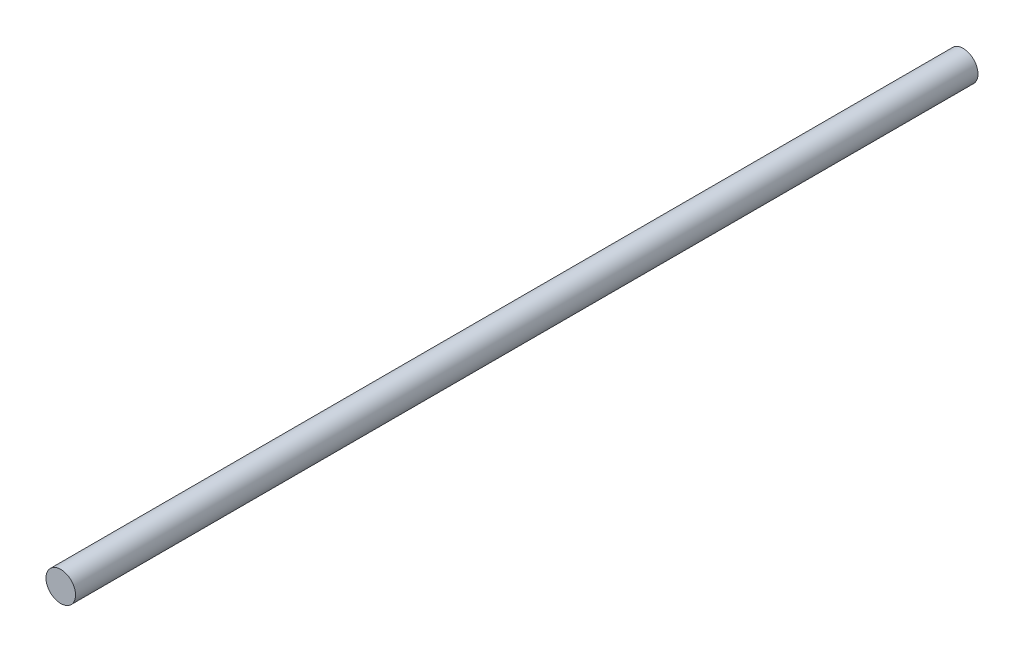
ISO-10303-21;
HEADER;
FILE_DESCRIPTION(('STEP AP214'),'2;1');
FILE_NAME('part.step','',(''),(''),'','','');
FILE_SCHEMA(('AUTOMOTIVE_DESIGN { 1 0 10303 214 1 1 1 1 }'));
ENDSEC;
DATA;
#1=APPLICATION_CONTEXT('core data for automotive mechanical design processes');
#2=APPLICATION_PROTOCOL_DEFINITION('international standard','automotive_design',2000,#1);
#3=PRODUCT_CONTEXT('',#1,'mechanical');
#4=PRODUCT('Part','Part','',(#3));
#5=PRODUCT_RELATED_PRODUCT_CATEGORY('part','',(#4));
#6=PRODUCT_DEFINITION_FORMATION('','',#4);
#7=PRODUCT_DEFINITION_CONTEXT('part definition',#1,'design');
#8=PRODUCT_DEFINITION('design','',#6,#7);
#9=PRODUCT_DEFINITION_SHAPE('','',#8);
#10=(LENGTH_UNIT() NAMED_UNIT(*) SI_UNIT(.MILLI.,.METRE.));
#11=(NAMED_UNIT(*) PLANE_ANGLE_UNIT() SI_UNIT($,.RADIAN.));
#12=(NAMED_UNIT(*) SI_UNIT($,.STERADIAN.) SOLID_ANGLE_UNIT());
#13=UNCERTAINTY_MEASURE_WITH_UNIT(LENGTH_MEASURE(1.E-05),#10,'distance_accuracy_value','');
#14=(GEOMETRIC_REPRESENTATION_CONTEXT(3) GLOBAL_UNCERTAINTY_ASSIGNED_CONTEXT((#13)) GLOBAL_UNIT_ASSIGNED_CONTEXT((#10,
#11,#12)) REPRESENTATION_CONTEXT('',''));
#15=CARTESIAN_POINT('',(0.,0.,0.));
#16=DIRECTION('',(0.,0.,1.));
#17=DIRECTION('',(1.,0.,0.));
#18=AXIS2_PLACEMENT_3D('',#15,#16,#17);
#19=CARTESIAN_POINT('',(0.,0.,91.5));
#20=DIRECTION('',(0.,0.,-1.));
#21=DIRECTION('',(-1.,0.,0.));
#22=AXIS2_PLACEMENT_3D('',#19,#20,#21);
#23=CYLINDRICAL_SURFACE('',#22,3.);
#24=CARTESIAN_POINT('',(0.,0.,91.5));
#25=DIRECTION('',(0.,0.,1.));
#26=DIRECTION('',(1.,0.,0.));
#27=AXIS2_PLACEMENT_3D('',#24,#25,#26);
#28=CIRCLE('',#27,3.);
#29=CARTESIAN_POINT('',(3.,0.,91.5));
#30=VERTEX_POINT('',#29);
#31=EDGE_CURVE('E10',#30,#30,#28,.T.);
#32=ORIENTED_EDGE('',*,*,#31,.F.);
#33=EDGE_LOOP('',(#32));
#34=FACE_BOUND('',#33,.T.);
#35=CARTESIAN_POINT('',(0.,0.,-91.5));
#36=DIRECTION('',(0.,0.,1.));
#37=DIRECTION('',(1.,0.,0.));
#38=AXIS2_PLACEMENT_3D('',#35,#36,#37);
#39=CIRCLE('',#38,3.);
#40=CARTESIAN_POINT('',(3.,0.,-91.5));
#41=VERTEX_POINT('',#40);
#42=EDGE_CURVE('E40',#41,#41,#39,.T.);
#43=ORIENTED_EDGE('',*,*,#42,.T.);
#44=EDGE_LOOP('',(#43));
#45=FACE_BOUND('',#44,.T.);
#46=ADVANCED_FACE('F37',(#34,#45),#23,.T.);
#47=CARTESIAN_POINT('',(0.,0.,91.5));
#48=DIRECTION('',(0.,0.,1.));
#49=DIRECTION('',(1.,0.,0.));
#50=AXIS2_PLACEMENT_3D('',#47,#48,#49);
#51=PLANE('',#50);
#52=ORIENTED_EDGE('',*,*,#31,.T.);
#53=EDGE_LOOP('',(#52));
#54=FACE_BOUND('',#53,.T.);
#55=ADVANCED_FACE('F54',(#54),#51,.T.);
#56=CARTESIAN_POINT('',(0.,0.,-91.5));
#57=DIRECTION('',(0.,0.,1.));
#58=DIRECTION('',(1.,0.,0.));
#59=AXIS2_PLACEMENT_3D('',#56,#57,#58);
#60=PLANE('',#59);
#61=ORIENTED_EDGE('',*,*,#42,.F.);
#62=EDGE_LOOP('',(#61));
#63=FACE_BOUND('',#62,.T.);
#64=ADVANCED_FACE('F52',(#63),#60,.F.);
#65=CLOSED_SHELL('',(#46,#55,#64));
#66=MANIFOLD_SOLID_BREP('B2',#65);
#67=ADVANCED_BREP_SHAPE_REPRESENTATION('',(#18,#66),#14);
#68=SHAPE_DEFINITION_REPRESENTATION(#9,#67);
ENDSEC;
END-ISO-10303-21;
